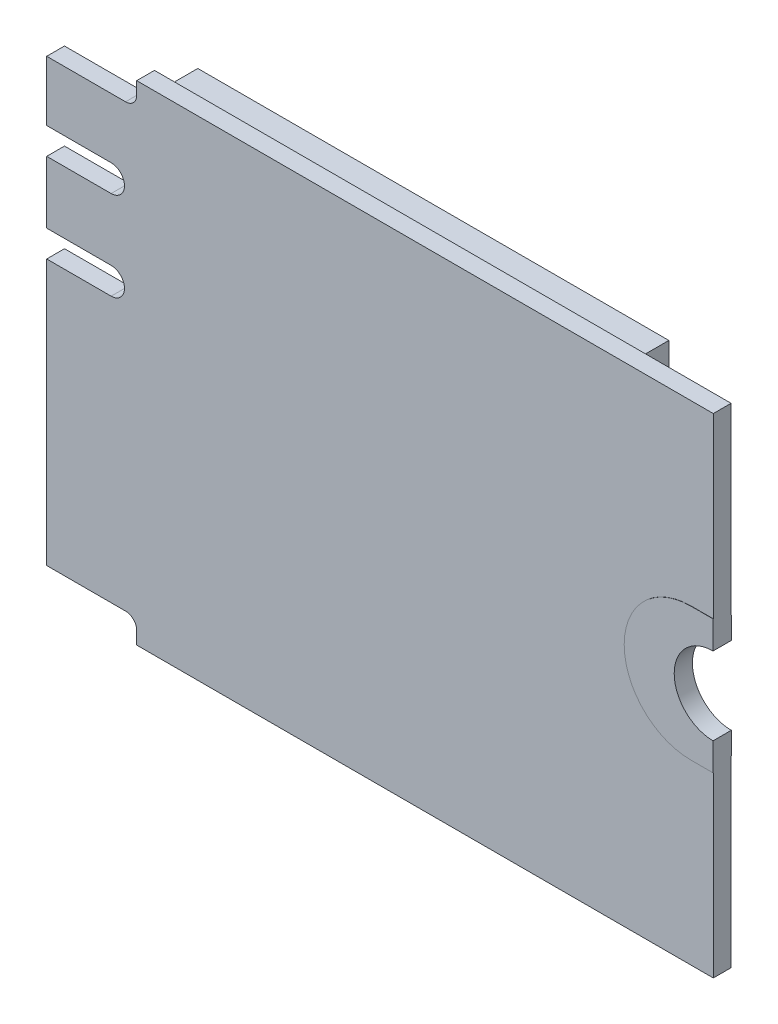
ISO-10303-21;
HEADER;
FILE_DESCRIPTION(('STEP AP214'),'2;1');
FILE_NAME('part.step','',(''),(''),'','','');
FILE_SCHEMA(('AUTOMOTIVE_DESIGN { 1 0 10303 214 1 1 1 1 }'));
ENDSEC;
DATA;
#1=APPLICATION_CONTEXT('core data for automotive mechanical design processes');
#2=APPLICATION_PROTOCOL_DEFINITION('international standard','automotive_design',2000,#1);
#3=PRODUCT_CONTEXT('',#1,'mechanical');
#4=PRODUCT('Part','Part','',(#3));
#5=PRODUCT_RELATED_PRODUCT_CATEGORY('part','',(#4));
#6=PRODUCT_DEFINITION_FORMATION('','',#4);
#7=PRODUCT_DEFINITION_CONTEXT('part definition',#1,'design');
#8=PRODUCT_DEFINITION('design','',#6,#7);
#9=PRODUCT_DEFINITION_SHAPE('','',#8);
#10=(LENGTH_UNIT() NAMED_UNIT(*) SI_UNIT(.MILLI.,.METRE.));
#11=(NAMED_UNIT(*) PLANE_ANGLE_UNIT() SI_UNIT($,.RADIAN.));
#12=(NAMED_UNIT(*) SI_UNIT($,.STERADIAN.) SOLID_ANGLE_UNIT());
#13=UNCERTAINTY_MEASURE_WITH_UNIT(LENGTH_MEASURE(1.E-05),#10,'distance_accuracy_value','');
#14=(GEOMETRIC_REPRESENTATION_CONTEXT(3) GLOBAL_UNCERTAINTY_ASSIGNED_CONTEXT((#13)) GLOBAL_UNIT_ASSIGNED_CONTEXT((#10,
#11,#12)) REPRESENTATION_CONTEXT('',''));
#15=CARTESIAN_POINT('',(0.,0.,0.));
#16=DIRECTION('',(0.,0.,1.));
#17=DIRECTION('',(1.,0.,0.));
#18=AXIS2_PLACEMENT_3D('',#15,#16,#17);
#19=CARTESIAN_POINT('',(72.22,5.45,-8.64));
#20=DIRECTION('',(0.,-1.,0.));
#21=DIRECTION('',(0.,0.,-1.));
#22=AXIS2_PLACEMENT_3D('',#19,#20,#21);
#23=PLANE('',#22);
#24=DIRECTION('',(0.,0.,-1.));
#25=VECTOR('',#24,1.);
#26=CARTESIAN_POINT('',(46.27,5.45,-8.64));
#27=LINE('',#26,#25);
#28=CARTESIAN_POINT('',(46.27,5.45,-8.64));
#29=VERTEX_POINT('',#28);
#30=CARTESIAN_POINT('',(46.27,5.45,-9.44));
#31=VERTEX_POINT('',#30);
#32=EDGE_CURVE('E11',#29,#31,#27,.T.);
#33=ORIENTED_EDGE('',*,*,#32,.T.);
#34=DIRECTION('',(-1.,0.,0.));
#35=VECTOR('',#34,1.);
#36=CARTESIAN_POINT('',(72.22,5.45,-9.44));
#37=LINE('',#36,#35);
#38=CARTESIAN_POINT('',(72.22,5.45,-9.44));
#39=VERTEX_POINT('',#38);
#40=EDGE_CURVE('E204',#39,#31,#37,.T.);
#41=ORIENTED_EDGE('',*,*,#40,.F.);
#42=DIRECTION('',(0.,0.,-1.));
#43=VECTOR('',#42,1.);
#44=CARTESIAN_POINT('',(72.22,5.45,-8.64));
#45=LINE('',#44,#43);
#46=CARTESIAN_POINT('',(72.22,5.45,-8.64));
#47=VERTEX_POINT('',#46);
#48=EDGE_CURVE('E170',#47,#39,#45,.T.);
#49=ORIENTED_EDGE('',*,*,#48,.F.);
#50=DIRECTION('',(-1.,0.,0.));
#51=VECTOR('',#50,1.);
#52=CARTESIAN_POINT('',(72.22,5.45,-8.64));
#53=LINE('',#52,#51);
#54=EDGE_CURVE('E379',#47,#29,#53,.T.);
#55=ORIENTED_EDGE('',*,*,#54,.T.);
#56=EDGE_LOOP('',(#33,#41,#49,#55));
#57=FACE_BOUND('',#56,.T.);
#58=ADVANCED_FACE('F17',(#57),#23,.T.);
#59=CARTESIAN_POINT('',(46.27,5.45,-8.64));
#60=DIRECTION('',(-1.,0.,0.));
#61=DIRECTION('',(0.,0.,1.));
#62=AXIS2_PLACEMENT_3D('',#59,#60,#61);
#63=PLANE('',#62);
#64=DIRECTION('',(0.,1.,0.));
#65=VECTOR('',#64,1.);
#66=CARTESIAN_POINT('',(46.27,5.45,-9.44));
#67=LINE('',#66,#65);
#68=CARTESIAN_POINT('',(46.27,6.025,-9.44));
#69=VERTEX_POINT('',#68);
#70=EDGE_CURVE('E382',#31,#69,#67,.T.);
#71=ORIENTED_EDGE('',*,*,#70,.F.);
#72=ORIENTED_EDGE('',*,*,#32,.F.);
#73=DIRECTION('',(0.,1.,0.));
#74=VECTOR('',#73,1.);
#75=CARTESIAN_POINT('',(46.27,5.45,-8.64));
#76=LINE('',#75,#74);
#77=CARTESIAN_POINT('',(46.27,6.025,-8.64));
#78=VERTEX_POINT('',#77);
#79=EDGE_CURVE('E376',#29,#78,#76,.T.);
#80=ORIENTED_EDGE('',*,*,#79,.T.);
#81=DIRECTION('',(0.,0.,-1.));
#82=VECTOR('',#81,1.);
#83=CARTESIAN_POINT('',(46.27,6.025,-8.64));
#84=LINE('',#83,#82);
#85=EDGE_CURVE('E28',#78,#69,#84,.T.);
#86=ORIENTED_EDGE('',*,*,#85,.T.);
#87=EDGE_LOOP('',(#71,#72,#80,#86));
#88=FACE_BOUND('',#87,.T.);
#89=ADVANCED_FACE('F1080',(#88),#63,.T.);
#90=CARTESIAN_POINT('',(45.77,6.025,-1.522344));
#91=DIRECTION('',(0.,0.,-1.));
#92=DIRECTION('',(0.,1.,0.));
#93=AXIS2_PLACEMENT_3D('',#90,#91,#92);
#94=CYLINDRICAL_SURFACE('',#93,0.5);
#95=CARTESIAN_POINT('',(45.77,6.025,-9.44));
#96=DIRECTION('',(0.,0.,1.));
#97=DIRECTION('',(1.,0.,0.));
#98=AXIS2_PLACEMENT_3D('',#95,#96,#97);
#99=CIRCLE('',#98,0.5);
#100=CARTESIAN_POINT('',(45.77,6.525,-9.44));
#101=VERTEX_POINT('',#100);
#102=EDGE_CURVE('E388',#69,#101,#99,.T.);
#103=ORIENTED_EDGE('',*,*,#102,.F.);
#104=ORIENTED_EDGE('',*,*,#85,.F.);
#105=CARTESIAN_POINT('',(45.77,6.025,-8.64));
#106=DIRECTION('',(0.,0.,-1.));
#107=DIRECTION('',(0.,1.,0.));
#108=AXIS2_PLACEMENT_3D('',#105,#106,#107);
#109=CIRCLE('',#108,0.5);
#110=CARTESIAN_POINT('',(45.77,6.525,-8.64));
#111=VERTEX_POINT('',#110);
#112=EDGE_CURVE('E380',#111,#78,#109,.T.);
#113=ORIENTED_EDGE('',*,*,#112,.F.);
#114=DIRECTION('',(0.,0.,-1.));
#115=VECTOR('',#114,1.);
#116=CARTESIAN_POINT('',(45.77,6.525,-8.64));
#117=LINE('',#116,#115);
#118=EDGE_CURVE('E540',#111,#101,#117,.T.);
#119=ORIENTED_EDGE('',*,*,#118,.T.);
#120=EDGE_LOOP('',(#103,#104,#113,#119));
#121=FACE_BOUND('',#120,.T.);
#122=ADVANCED_FACE('F1043',(#121),#94,.F.);
#123=CARTESIAN_POINT('',(46.27,6.525,-8.64));
#124=DIRECTION('',(0.,-1.,0.));
#125=DIRECTION('',(0.,0.,-1.));
#126=AXIS2_PLACEMENT_3D('',#123,#124,#125);
#127=PLANE('',#126);
#128=DIRECTION('',(-1.,0.,0.));
#129=VECTOR('',#128,1.);
#130=CARTESIAN_POINT('',(45.77,6.525,-8.64));
#131=LINE('',#130,#129);
#132=CARTESIAN_POINT('',(42.22,6.525,-8.64));
#133=VERTEX_POINT('',#132);
#134=EDGE_CURVE('E533',#111,#133,#131,.T.);
#135=ORIENTED_EDGE('',*,*,#134,.T.);
#136=DIRECTION('',(0.,0.,-1.));
#137=VECTOR('',#136,1.);
#138=CARTESIAN_POINT('',(42.22,6.525,-8.64));
#139=LINE('',#138,#137);
#140=CARTESIAN_POINT('',(42.22,6.525,-9.44));
#141=VERTEX_POINT('',#140);
#142=EDGE_CURVE('E537',#133,#141,#139,.T.);
#143=ORIENTED_EDGE('',*,*,#142,.T.);
#144=DIRECTION('',(-1.,0.,0.));
#145=VECTOR('',#144,1.);
#146=CARTESIAN_POINT('',(45.77,6.525,-9.44));
#147=LINE('',#146,#145);
#148=EDGE_CURVE('E397',#101,#141,#147,.T.);
#149=ORIENTED_EDGE('',*,*,#148,.F.);
#150=ORIENTED_EDGE('',*,*,#118,.F.);
#151=EDGE_LOOP('',(#135,#143,#149,#150));
#152=FACE_BOUND('',#151,.T.);
#153=ADVANCED_FACE('F1037',(#152),#127,.T.);
#154=CARTESIAN_POINT('',(42.22,6.525,-8.64));
#155=DIRECTION('',(-1.,0.,0.));
#156=DIRECTION('',(0.,0.,1.));
#157=AXIS2_PLACEMENT_3D('',#154,#155,#156);
#158=PLANE('',#157);
#159=DIRECTION('',(0.,0.,-1.));
#160=VECTOR('',#159,1.);
#161=CARTESIAN_POINT('',(42.22,18.475,-8.64));
#162=LINE('',#161,#160);
#163=CARTESIAN_POINT('',(42.22,18.475,-8.64));
#164=VERTEX_POINT('',#163);
#165=CARTESIAN_POINT('',(42.22,18.475,-9.44));
#166=VERTEX_POINT('',#165);
#167=EDGE_CURVE('E541',#164,#166,#162,.T.);
#168=ORIENTED_EDGE('',*,*,#167,.T.);
#169=DIRECTION('',(0.,1.,0.));
#170=VECTOR('',#169,1.);
#171=CARTESIAN_POINT('',(42.22,6.525,-9.44));
#172=LINE('',#171,#170);
#173=EDGE_CURVE('E478',#141,#166,#172,.T.);
#174=ORIENTED_EDGE('',*,*,#173,.F.);
#175=ORIENTED_EDGE('',*,*,#142,.F.);
#176=DIRECTION('',(0.,1.,0.));
#177=VECTOR('',#176,1.);
#178=CARTESIAN_POINT('',(42.22,6.525,-8.64));
#179=LINE('',#178,#177);
#180=EDGE_CURVE('E21',#133,#164,#179,.T.);
#181=ORIENTED_EDGE('',*,*,#180,.T.);
#182=EDGE_LOOP('',(#168,#174,#175,#181));
#183=FACE_BOUND('',#182,.T.);
#184=ADVANCED_FACE('F1042',(#183),#158,.T.);
#185=CARTESIAN_POINT('',(42.22,18.475,-8.64));
#186=DIRECTION('',(0.,1.,0.));
#187=DIRECTION('',(1.,0.,0.));
#188=AXIS2_PLACEMENT_3D('',#185,#186,#187);
#189=PLANE('',#188);
#190=DIRECTION('',(1.,0.,0.));
#191=VECTOR('',#190,1.);
#192=CARTESIAN_POINT('',(42.22,18.475,-9.44));
#193=LINE('',#192,#191);
#194=CARTESIAN_POINT('',(45.12,18.475,-9.44));
#195=VERTEX_POINT('',#194);
#196=EDGE_CURVE('E482',#166,#195,#193,.T.);
#197=ORIENTED_EDGE('',*,*,#196,.F.);
#198=ORIENTED_EDGE('',*,*,#167,.F.);
#199=DIRECTION('',(1.,0.,0.));
#200=VECTOR('',#199,1.);
#201=CARTESIAN_POINT('',(42.22,18.475,-8.64));
#202=LINE('',#201,#200);
#203=CARTESIAN_POINT('',(45.12,18.475,-8.64));
#204=VERTEX_POINT('',#203);
#205=EDGE_CURVE('E527',#164,#204,#202,.T.);
#206=ORIENTED_EDGE('',*,*,#205,.T.);
#207=DIRECTION('',(0.,0.,-1.));
#208=VECTOR('',#207,1.);
#209=CARTESIAN_POINT('',(45.12,18.475,-8.64));
#210=LINE('',#209,#208);
#211=EDGE_CURVE('E546',#204,#195,#210,.T.);
#212=ORIENTED_EDGE('',*,*,#211,.T.);
#213=EDGE_LOOP('',(#197,#198,#206,#212));
#214=FACE_BOUND('',#213,.T.);
#215=ADVANCED_FACE('F19',(#214),#189,.T.);
#216=CARTESIAN_POINT('',(45.12,19.075,-1.522344));
#217=DIRECTION('',(0.,0.,-1.));
#218=DIRECTION('',(0.,1.,0.));
#219=AXIS2_PLACEMENT_3D('',#216,#217,#218);
#220=CYLINDRICAL_SURFACE('',#219,0.6);
#221=CARTESIAN_POINT('',(45.12,19.075,-9.44));
#222=DIRECTION('',(0.,0.,-1.));
#223=DIRECTION('',(0.,1.,0.));
#224=AXIS2_PLACEMENT_3D('',#221,#222,#223);
#225=CIRCLE('',#224,0.6);
#226=CARTESIAN_POINT('',(45.12,19.675,-9.44));
#227=VERTEX_POINT('',#226);
#228=EDGE_CURVE('E504',#227,#195,#225,.T.);
#229=ORIENTED_EDGE('',*,*,#228,.T.);
#230=ORIENTED_EDGE('',*,*,#211,.F.);
#231=CARTESIAN_POINT('',(45.12,19.075,-8.64));
#232=DIRECTION('',(0.,0.,1.));
#233=DIRECTION('',(0.,-1.,0.));
#234=AXIS2_PLACEMENT_3D('',#231,#232,#233);
#235=CIRCLE('',#234,0.6);
#236=CARTESIAN_POINT('',(45.12,19.675,-8.64));
#237=VERTEX_POINT('',#236);
#238=EDGE_CURVE('E523',#204,#237,#235,.T.);
#239=ORIENTED_EDGE('',*,*,#238,.T.);
#240=DIRECTION('',(0.,0.,-1.));
#241=VECTOR('',#240,1.);
#242=CARTESIAN_POINT('',(45.12,19.675,-8.64));
#243=LINE('',#242,#241);
#244=EDGE_CURVE('E340',#237,#227,#243,.T.);
#245=ORIENTED_EDGE('',*,*,#244,.T.);
#246=EDGE_LOOP('',(#229,#230,#239,#245));
#247=FACE_BOUND('',#246,.T.);
#248=ADVANCED_FACE('F1110',(#247),#220,.F.);
#249=CARTESIAN_POINT('',(45.72,19.675,-8.64));
#250=DIRECTION('',(0.,-1.,0.));
#251=DIRECTION('',(0.,0.,-1.));
#252=AXIS2_PLACEMENT_3D('',#249,#250,#251);
#253=PLANE('',#252);
#254=DIRECTION('',(-1.,0.,0.));
#255=VECTOR('',#254,1.);
#256=CARTESIAN_POINT('',(45.12,19.675,-8.64));
#257=LINE('',#256,#255);
#258=CARTESIAN_POINT('',(42.22,19.675,-8.64));
#259=VERTEX_POINT('',#258);
#260=EDGE_CURVE('E474',#237,#259,#257,.T.);
#261=ORIENTED_EDGE('',*,*,#260,.T.);
#262=DIRECTION('',(0.,0.,-1.));
#263=VECTOR('',#262,1.);
#264=CARTESIAN_POINT('',(42.22,19.675,-8.64));
#265=LINE('',#264,#263);
#266=CARTESIAN_POINT('',(42.22,19.675,-9.44));
#267=VERTEX_POINT('',#266);
#268=EDGE_CURVE('E337',#259,#267,#265,.T.);
#269=ORIENTED_EDGE('',*,*,#268,.T.);
#270=DIRECTION('',(-1.,0.,0.));
#271=VECTOR('',#270,1.);
#272=CARTESIAN_POINT('',(45.12,19.675,-9.44));
#273=LINE('',#272,#271);
#274=EDGE_CURVE('E470',#227,#267,#273,.T.);
#275=ORIENTED_EDGE('',*,*,#274,.F.);
#276=ORIENTED_EDGE('',*,*,#244,.F.);
#277=EDGE_LOOP('',(#261,#269,#275,#276));
#278=FACE_BOUND('',#277,.T.);
#279=ADVANCED_FACE('F1115',(#278),#253,.T.);
#280=CARTESIAN_POINT('',(42.22,19.675,-8.64));
#281=DIRECTION('',(-1.,0.,0.));
#282=DIRECTION('',(0.,0.,1.));
#283=AXIS2_PLACEMENT_3D('',#280,#281,#282);
#284=PLANE('',#283);
#285=DIRECTION('',(0.,0.,-1.));
#286=VECTOR('',#285,1.);
#287=CARTESIAN_POINT('',(42.22,22.475,-8.64));
#288=LINE('',#287,#286);
#289=CARTESIAN_POINT('',(42.22,22.475,-8.64));
#290=VERTEX_POINT('',#289);
#291=CARTESIAN_POINT('',(42.22,22.475,-9.44));
#292=VERTEX_POINT('',#291);
#293=EDGE_CURVE('E341',#290,#292,#288,.T.);
#294=ORIENTED_EDGE('',*,*,#293,.T.);
#295=DIRECTION('',(0.,1.,0.));
#296=VECTOR('',#295,1.);
#297=CARTESIAN_POINT('',(42.22,19.675,-9.44));
#298=LINE('',#297,#296);
#299=EDGE_CURVE('E465',#267,#292,#298,.T.);
#300=ORIENTED_EDGE('',*,*,#299,.F.);
#301=ORIENTED_EDGE('',*,*,#268,.F.);
#302=DIRECTION('',(0.,1.,0.));
#303=VECTOR('',#302,1.);
#304=CARTESIAN_POINT('',(42.22,19.675,-8.64));
#305=LINE('',#304,#303);
#306=EDGE_CURVE('E464',#259,#290,#305,.T.);
#307=ORIENTED_EDGE('',*,*,#306,.T.);
#308=EDGE_LOOP('',(#294,#300,#301,#307));
#309=FACE_BOUND('',#308,.T.);
#310=ADVANCED_FACE('F1168',(#309),#284,.T.);
#311=CARTESIAN_POINT('',(42.22,22.475,-8.64));
#312=DIRECTION('',(0.,1.,0.));
#313=DIRECTION('',(1.,0.,0.));
#314=AXIS2_PLACEMENT_3D('',#311,#312,#313);
#315=PLANE('',#314);
#316=DIRECTION('',(1.,0.,0.));
#317=VECTOR('',#316,1.);
#318=CARTESIAN_POINT('',(42.22,22.475,-9.44));
#319=LINE('',#318,#317);
#320=CARTESIAN_POINT('',(45.12,22.475,-9.44));
#321=VERTEX_POINT('',#320);
#322=EDGE_CURVE('E469',#292,#321,#319,.T.);
#323=ORIENTED_EDGE('',*,*,#322,.F.);
#324=ORIENTED_EDGE('',*,*,#293,.F.);
#325=DIRECTION('',(1.,0.,0.));
#326=VECTOR('',#325,1.);
#327=CARTESIAN_POINT('',(42.22,22.475,-8.64));
#328=LINE('',#327,#326);
#329=CARTESIAN_POINT('',(45.12,22.475,-8.64));
#330=VERTEX_POINT('',#329);
#331=EDGE_CURVE('E460',#290,#330,#328,.T.);
#332=ORIENTED_EDGE('',*,*,#331,.T.);
#333=DIRECTION('',(0.,0.,-1.));
#334=VECTOR('',#333,1.);
#335=CARTESIAN_POINT('',(45.12,22.475,-8.64));
#336=LINE('',#335,#334);
#337=EDGE_CURVE('E492',#330,#321,#336,.T.);
#338=ORIENTED_EDGE('',*,*,#337,.T.);
#339=EDGE_LOOP('',(#323,#324,#332,#338));
#340=FACE_BOUND('',#339,.T.);
#341=ADVANCED_FACE('F1103',(#340),#315,.T.);
#342=CARTESIAN_POINT('',(45.12,23.075,-1.522344));
#343=DIRECTION('',(0.,0.,-1.));
#344=DIRECTION('',(0.,1.,0.));
#345=AXIS2_PLACEMENT_3D('',#342,#343,#344);
#346=CYLINDRICAL_SURFACE('',#345,0.6);
#347=CARTESIAN_POINT('',(45.12,23.075,-9.44));
#348=DIRECTION('',(0.,0.,-1.));
#349=DIRECTION('',(0.,1.,0.));
#350=AXIS2_PLACEMENT_3D('',#347,#348,#349);
#351=CIRCLE('',#350,0.6);
#352=CARTESIAN_POINT('',(45.12,23.675,-9.44));
#353=VERTEX_POINT('',#352);
#354=EDGE_CURVE('E522',#353,#321,#351,.T.);
#355=ORIENTED_EDGE('',*,*,#354,.T.);
#356=ORIENTED_EDGE('',*,*,#337,.F.);
#357=CARTESIAN_POINT('',(45.12,23.075,-8.64));
#358=DIRECTION('',(0.,0.,1.));
#359=DIRECTION('',(0.,-1.,0.));
#360=AXIS2_PLACEMENT_3D('',#357,#358,#359);
#361=CIRCLE('',#360,0.6);
#362=CARTESIAN_POINT('',(45.12,23.675,-8.64));
#363=VERTEX_POINT('',#362);
#364=EDGE_CURVE('E459',#330,#363,#361,.T.);
#365=ORIENTED_EDGE('',*,*,#364,.T.);
#366=DIRECTION('',(0.,0.,-1.));
#367=VECTOR('',#366,1.);
#368=CARTESIAN_POINT('',(45.12,23.675,-8.64));
#369=LINE('',#368,#367);
#370=EDGE_CURVE('E349',#363,#353,#369,.T.);
#371=ORIENTED_EDGE('',*,*,#370,.T.);
#372=EDGE_LOOP('',(#355,#356,#365,#371));
#373=FACE_BOUND('',#372,.T.);
#374=ADVANCED_FACE('F1097',(#373),#346,.F.);
#375=CARTESIAN_POINT('',(45.72,23.675,-8.64));
#376=DIRECTION('',(0.,-1.,0.));
#377=DIRECTION('',(0.,0.,-1.));
#378=AXIS2_PLACEMENT_3D('',#375,#376,#377);
#379=PLANE('',#378);
#380=DIRECTION('',(-1.,0.,0.));
#381=VECTOR('',#380,1.);
#382=CARTESIAN_POINT('',(45.12,23.675,-8.64));
#383=LINE('',#382,#381);
#384=CARTESIAN_POINT('',(42.22,23.675,-8.64));
#385=VERTEX_POINT('',#384);
#386=EDGE_CURVE('E300',#363,#385,#383,.T.);
#387=ORIENTED_EDGE('',*,*,#386,.T.);
#388=DIRECTION('',(0.,0.,-1.));
#389=VECTOR('',#388,1.);
#390=CARTESIAN_POINT('',(42.22,23.675,-8.64));
#391=LINE('',#390,#389);
#392=CARTESIAN_POINT('',(42.22,23.675,-9.44));
#393=VERTEX_POINT('',#392);
#394=EDGE_CURVE('E273',#385,#393,#391,.T.);
#395=ORIENTED_EDGE('',*,*,#394,.T.);
#396=DIRECTION('',(-1.,0.,0.));
#397=VECTOR('',#396,1.);
#398=CARTESIAN_POINT('',(45.12,23.675,-9.44));
#399=LINE('',#398,#397);
#400=EDGE_CURVE('E401',#353,#393,#399,.T.);
#401=ORIENTED_EDGE('',*,*,#400,.F.);
#402=ORIENTED_EDGE('',*,*,#370,.F.);
#403=EDGE_LOOP('',(#387,#395,#401,#402));
#404=FACE_BOUND('',#403,.T.);
#405=ADVANCED_FACE('F1102',(#404),#379,.T.);
#406=CARTESIAN_POINT('',(42.22,23.675,-8.64));
#407=DIRECTION('',(-1.,0.,0.));
#408=DIRECTION('',(0.,0.,1.));
#409=AXIS2_PLACEMENT_3D('',#406,#407,#408);
#410=PLANE('',#409);
#411=DIRECTION('',(0.,0.,-1.));
#412=VECTOR('',#411,1.);
#413=CARTESIAN_POINT('',(42.22,26.375,-8.64));
#414=LINE('',#413,#412);
#415=CARTESIAN_POINT('',(42.22,26.375,-8.64));
#416=VERTEX_POINT('',#415);
#417=CARTESIAN_POINT('',(42.22,26.375,-9.44));
#418=VERTEX_POINT('',#417);
#419=EDGE_CURVE('E262',#416,#418,#414,.T.);
#420=ORIENTED_EDGE('',*,*,#419,.T.);
#421=DIRECTION('',(0.,1.,0.));
#422=VECTOR('',#421,1.);
#423=CARTESIAN_POINT('',(42.22,23.675,-9.44));
#424=LINE('',#423,#422);
#425=EDGE_CURVE('E456',#393,#418,#424,.T.);
#426=ORIENTED_EDGE('',*,*,#425,.F.);
#427=ORIENTED_EDGE('',*,*,#394,.F.);
#428=DIRECTION('',(0.,1.,0.));
#429=VECTOR('',#428,1.);
#430=CARTESIAN_POINT('',(42.22,23.675,-8.64));
#431=LINE('',#430,#429);
#432=EDGE_CURVE('E295',#385,#416,#431,.T.);
#433=ORIENTED_EDGE('',*,*,#432,.T.);
#434=EDGE_LOOP('',(#420,#426,#427,#433));
#435=FACE_BOUND('',#434,.T.);
#436=ADVANCED_FACE('F296',(#435),#410,.T.);
#437=CARTESIAN_POINT('',(42.22,26.375,-8.64));
#438=DIRECTION('',(0.,1.,0.));
#439=DIRECTION('',(1.,0.,0.));
#440=AXIS2_PLACEMENT_3D('',#437,#438,#439);
#441=PLANE('',#440);
#442=DIRECTION('',(1.,0.,0.));
#443=VECTOR('',#442,1.);
#444=CARTESIAN_POINT('',(42.22,26.375,-9.44));
#445=LINE('',#444,#443);
#446=CARTESIAN_POINT('',(45.77,26.375,-9.44));
#447=VERTEX_POINT('',#446);
#448=EDGE_CURVE('E289',#418,#447,#445,.T.);
#449=ORIENTED_EDGE('',*,*,#448,.F.);
#450=ORIENTED_EDGE('',*,*,#419,.F.);
#451=DIRECTION('',(1.,0.,0.));
#452=VECTOR('',#451,1.);
#453=CARTESIAN_POINT('',(42.22,26.375,-8.64));
#454=LINE('',#453,#452);
#455=CARTESIAN_POINT('',(45.77,26.375,-8.64));
#456=VERTEX_POINT('',#455);
#457=EDGE_CURVE('E286',#416,#456,#454,.T.);
#458=ORIENTED_EDGE('',*,*,#457,.T.);
#459=DIRECTION('',(0.,0.,-1.));
#460=VECTOR('',#459,1.);
#461=CARTESIAN_POINT('',(45.77,26.375,-8.64));
#462=LINE('',#461,#460);
#463=EDGE_CURVE('E292',#456,#447,#462,.T.);
#464=ORIENTED_EDGE('',*,*,#463,.T.);
#465=EDGE_LOOP('',(#449,#450,#458,#464));
#466=FACE_BOUND('',#465,.T.);
#467=ADVANCED_FACE('F284',(#466),#441,.T.);
#468=CARTESIAN_POINT('',(45.77,26.875,-1.522344));
#469=DIRECTION('',(0.,0.,-1.));
#470=DIRECTION('',(1.,0.,0.));
#471=AXIS2_PLACEMENT_3D('',#468,#469,#470);
#472=CYLINDRICAL_SURFACE('',#471,0.5);
#473=CARTESIAN_POINT('',(45.77,26.875,-9.44));
#474=DIRECTION('',(0.,0.,1.));
#475=DIRECTION('',(0.,-1.,0.));
#476=AXIS2_PLACEMENT_3D('',#473,#474,#475);
#477=CIRCLE('',#476,0.5);
#478=CARTESIAN_POINT('',(46.27,26.875,-9.44));
#479=VERTEX_POINT('',#478);
#480=EDGE_CURVE('E346',#447,#479,#477,.T.);
#481=ORIENTED_EDGE('',*,*,#480,.F.);
#482=ORIENTED_EDGE('',*,*,#463,.F.);
#483=CARTESIAN_POINT('',(45.77,26.875,-8.64));
#484=DIRECTION('',(0.,0.,-1.));
#485=DIRECTION('',(1.,0.,0.));
#486=AXIS2_PLACEMENT_3D('',#483,#484,#485);
#487=CIRCLE('',#486,0.5);
#488=CARTESIAN_POINT('',(46.27,26.875,-8.64));
#489=VERTEX_POINT('',#488);
#490=EDGE_CURVE('E306',#489,#456,#487,.T.);
#491=ORIENTED_EDGE('',*,*,#490,.F.);
#492=DIRECTION('',(0.,0.,-1.));
#493=VECTOR('',#492,1.);
#494=CARTESIAN_POINT('',(46.27,26.875,-8.64));
#495=LINE('',#494,#493);
#496=EDGE_CURVE('E356',#489,#479,#495,.T.);
#497=ORIENTED_EDGE('',*,*,#496,.T.);
#498=EDGE_LOOP('',(#481,#482,#491,#497));
#499=FACE_BOUND('',#498,.T.);
#500=ADVANCED_FACE('F1122',(#499),#472,.F.);
#501=CARTESIAN_POINT('',(46.27,26.375,-8.64));
#502=DIRECTION('',(-1.,0.,0.));
#503=DIRECTION('',(0.,0.,1.));
#504=AXIS2_PLACEMENT_3D('',#501,#502,#503);
#505=PLANE('',#504);
#506=DIRECTION('',(0.,1.,0.));
#507=VECTOR('',#506,1.);
#508=CARTESIAN_POINT('',(46.27,26.875,-8.64));
#509=LINE('',#508,#507);
#510=CARTESIAN_POINT('',(46.27,27.45,-8.64));
#511=VERTEX_POINT('',#510);
#512=EDGE_CURVE('E315',#489,#511,#509,.T.);
#513=ORIENTED_EDGE('',*,*,#512,.T.);
#514=DIRECTION('',(0.,0.,-1.));
#515=VECTOR('',#514,1.);
#516=CARTESIAN_POINT('',(46.27,27.45,-8.64));
#517=LINE('',#516,#515);
#518=CARTESIAN_POINT('',(46.27,27.45,-9.44));
#519=VERTEX_POINT('',#518);
#520=EDGE_CURVE('E566',#511,#519,#517,.T.);
#521=ORIENTED_EDGE('',*,*,#520,.T.);
#522=DIRECTION('',(0.,1.,0.));
#523=VECTOR('',#522,1.);
#524=CARTESIAN_POINT('',(46.27,26.875,-9.44));
#525=LINE('',#524,#523);
#526=EDGE_CURVE('E342',#479,#519,#525,.T.);
#527=ORIENTED_EDGE('',*,*,#526,.F.);
#528=ORIENTED_EDGE('',*,*,#496,.F.);
#529=EDGE_LOOP('',(#513,#521,#527,#528));
#530=FACE_BOUND('',#529,.T.);
#531=ADVANCED_FACE('F1090',(#530),#505,.T.);
#532=CARTESIAN_POINT('',(46.27,27.45,-8.64));
#533=DIRECTION('',(0.,1.,0.));
#534=DIRECTION('',(1.,0.,0.));
#535=AXIS2_PLACEMENT_3D('',#532,#533,#534);
#536=PLANE('',#535);
#537=DIRECTION('',(0.,0.,-1.));
#538=VECTOR('',#537,1.);
#539=CARTESIAN_POINT('',(72.22,27.45,-8.64));
#540=LINE('',#539,#538);
#541=CARTESIAN_POINT('',(72.22,27.45,-8.64));
#542=VERTEX_POINT('',#541);
#543=CARTESIAN_POINT('',(72.22,27.45,-9.44));
#544=VERTEX_POINT('',#543);
#545=EDGE_CURVE('E496',#542,#544,#540,.T.);
#546=ORIENTED_EDGE('',*,*,#545,.T.);
#547=DIRECTION('',(1.,0.,0.));
#548=VECTOR('',#547,1.);
#549=CARTESIAN_POINT('',(46.27,27.45,-9.44));
#550=LINE('',#549,#548);
#551=EDGE_CURVE('E319',#519,#544,#550,.T.);
#552=ORIENTED_EDGE('',*,*,#551,.F.);
#553=ORIENTED_EDGE('',*,*,#520,.F.);
#554=DIRECTION('',(1.,0.,0.));
#555=VECTOR('',#554,1.);
#556=CARTESIAN_POINT('',(46.27,27.45,-8.64));
#557=LINE('',#556,#555);
#558=EDGE_CURVE('E367',#511,#542,#557,.T.);
#559=ORIENTED_EDGE('',*,*,#558,.T.);
#560=EDGE_LOOP('',(#546,#552,#553,#559));
#561=FACE_BOUND('',#560,.T.);
#562=ADVANCED_FACE('F1085',(#561),#536,.T.);
#563=CARTESIAN_POINT('',(0.,0.,-10.89));
#564=DIRECTION('',(0.,0.,-1.));
#565=DIRECTION('',(0.,-1.,0.));
#566=AXIS2_PLACEMENT_3D('',#563,#564,#565);
#567=PLANE('',#566);
#568=DIRECTION('',(-1.,0.,0.));
#569=VECTOR('',#568,1.);
#570=CARTESIAN_POINT('',(67.97,5.85,-10.89));
#571=LINE('',#570,#569);
#572=CARTESIAN_POINT('',(67.97,5.85,-10.89));
#573=VERTEX_POINT('',#572);
#574=CARTESIAN_POINT('',(46.77,5.85,-10.89));
#575=VERTEX_POINT('',#574);
#576=EDGE_CURVE('E42',#573,#575,#571,.T.);
#577=ORIENTED_EDGE('',*,*,#576,.T.);
#578=DIRECTION('',(0.,1.,0.));
#579=VECTOR('',#578,1.);
#580=CARTESIAN_POINT('',(46.77,5.85,-10.89));
#581=LINE('',#580,#579);
#582=CARTESIAN_POINT('',(46.77,27.05,-10.89));
#583=VERTEX_POINT('',#582);
#584=EDGE_CURVE('E335',#575,#583,#581,.T.);
#585=ORIENTED_EDGE('',*,*,#584,.T.);
#586=DIRECTION('',(1.,0.,0.));
#587=VECTOR('',#586,1.);
#588=CARTESIAN_POINT('',(46.77,27.05,-10.89));
#589=LINE('',#588,#587);
#590=CARTESIAN_POINT('',(67.97,27.05,-10.89));
#591=VERTEX_POINT('',#590);
#592=EDGE_CURVE('E330',#583,#591,#589,.T.);
#593=ORIENTED_EDGE('',*,*,#592,.T.);
#594=DIRECTION('',(0.,-1.,0.));
#595=VECTOR('',#594,1.);
#596=CARTESIAN_POINT('',(67.97,27.05,-10.89));
#597=LINE('',#596,#595);
#598=EDGE_CURVE('E331',#591,#573,#597,.T.);
#599=ORIENTED_EDGE('',*,*,#598,.T.);
#600=EDGE_LOOP('',(#577,#585,#593,#599));
#601=FACE_BOUND('',#600,.T.);
#602=ADVANCED_FACE('F1068',(#601),#567,.T.);
#603=CARTESIAN_POINT('',(67.97,5.85,-9.44));
#604=DIRECTION('',(0.,-1.,0.));
#605=DIRECTION('',(0.,0.,-1.));
#606=AXIS2_PLACEMENT_3D('',#603,#604,#605);
#607=PLANE('',#606);
#608=DIRECTION('',(0.,0.,-1.));
#609=VECTOR('',#608,1.);
#610=CARTESIAN_POINT('',(46.77,5.85,-9.44));
#611=LINE('',#610,#609);
#612=CARTESIAN_POINT('',(46.77,5.85,-9.44));
#613=VERTEX_POINT('',#612);
#614=EDGE_CURVE('E528',#613,#575,#611,.T.);
#615=ORIENTED_EDGE('',*,*,#614,.T.);
#616=ORIENTED_EDGE('',*,*,#576,.F.);
#617=DIRECTION('',(0.,0.,-1.));
#618=VECTOR('',#617,1.);
#619=CARTESIAN_POINT('',(67.97,5.85,-9.44));
#620=LINE('',#619,#618);
#621=CARTESIAN_POINT('',(67.97,5.85,-9.44));
#622=VERTEX_POINT('',#621);
#623=EDGE_CURVE('E489',#622,#573,#620,.T.);
#624=ORIENTED_EDGE('',*,*,#623,.F.);
#625=DIRECTION('',(-1.,0.,0.));
#626=VECTOR('',#625,1.);
#627=CARTESIAN_POINT('',(67.97,5.85,-9.44));
#628=LINE('',#627,#626);
#629=EDGE_CURVE('E374',#622,#613,#628,.T.);
#630=ORIENTED_EDGE('',*,*,#629,.T.);
#631=EDGE_LOOP('',(#615,#616,#624,#630));
#632=FACE_BOUND('',#631,.T.);
#633=ADVANCED_FACE('F1062',(#632),#607,.T.);
#634=CARTESIAN_POINT('',(46.77,5.85,-9.44));
#635=DIRECTION('',(-1.,0.,0.));
#636=DIRECTION('',(0.,0.,1.));
#637=AXIS2_PLACEMENT_3D('',#634,#635,#636);
#638=PLANE('',#637);
#639=DIRECTION('',(0.,0.,-1.));
#640=VECTOR('',#639,1.);
#641=CARTESIAN_POINT('',(46.77,27.05,-9.44));
#642=LINE('',#641,#640);
#643=CARTESIAN_POINT('',(46.77,27.05,-9.44));
#644=VERTEX_POINT('',#643);
#645=EDGE_CURVE('E332',#644,#583,#642,.T.);
#646=ORIENTED_EDGE('',*,*,#645,.T.);
#647=ORIENTED_EDGE('',*,*,#584,.F.);
#648=ORIENTED_EDGE('',*,*,#614,.F.);
#649=DIRECTION('',(0.,1.,0.));
#650=VECTOR('',#649,1.);
#651=CARTESIAN_POINT('',(46.77,5.85,-9.44));
#652=LINE('',#651,#650);
#653=EDGE_CURVE('E370',#613,#644,#652,.T.);
#654=ORIENTED_EDGE('',*,*,#653,.T.);
#655=EDGE_LOOP('',(#646,#647,#648,#654));
#656=FACE_BOUND('',#655,.T.);
#657=ADVANCED_FACE('F1067',(#656),#638,.T.);
#658=CARTESIAN_POINT('',(46.77,27.05,-9.44));
#659=DIRECTION('',(0.,1.,0.));
#660=DIRECTION('',(1.,0.,0.));
#661=AXIS2_PLACEMENT_3D('',#658,#659,#660);
#662=PLANE('',#661);
#663=DIRECTION('',(0.,0.,-1.));
#664=VECTOR('',#663,1.);
#665=CARTESIAN_POINT('',(67.97,27.05,-9.44));
#666=LINE('',#665,#664);
#667=CARTESIAN_POINT('',(67.97,27.05,-9.44));
#668=VERTEX_POINT('',#667);
#669=EDGE_CURVE('E326',#668,#591,#666,.T.);
#670=ORIENTED_EDGE('',*,*,#669,.T.);
#671=ORIENTED_EDGE('',*,*,#592,.F.);
#672=ORIENTED_EDGE('',*,*,#645,.F.);
#673=DIRECTION('',(1.,0.,0.));
#674=VECTOR('',#673,1.);
#675=CARTESIAN_POINT('',(46.77,27.05,-9.44));
#676=LINE('',#675,#674);
#677=EDGE_CURVE('E375',#644,#668,#676,.T.);
#678=ORIENTED_EDGE('',*,*,#677,.T.);
#679=EDGE_LOOP('',(#670,#671,#672,#678));
#680=FACE_BOUND('',#679,.T.);
#681=ADVANCED_FACE('F1225',(#680),#662,.T.);
#682=CARTESIAN_POINT('',(67.97,27.05,-9.44));
#683=DIRECTION('',(1.,0.,0.));
#684=DIRECTION('',(0.,1.,0.));
#685=AXIS2_PLACEMENT_3D('',#682,#683,#684);
#686=PLANE('',#685);
#687=ORIENTED_EDGE('',*,*,#623,.T.);
#688=ORIENTED_EDGE('',*,*,#598,.F.);
#689=ORIENTED_EDGE('',*,*,#669,.F.);
#690=DIRECTION('',(0.,-1.,0.));
#691=VECTOR('',#690,1.);
#692=CARTESIAN_POINT('',(67.97,27.05,-9.44));
#693=LINE('',#692,#691);
#694=EDGE_CURVE('E485',#668,#622,#693,.T.);
#695=ORIENTED_EDGE('',*,*,#694,.T.);
#696=EDGE_LOOP('',(#687,#688,#689,#695));
#697=FACE_BOUND('',#696,.T.);
#698=ADVANCED_FACE('F1230',(#697),#686,.T.);
#699=CARTESIAN_POINT('',(0.,0.,-9.44));
#700=DIRECTION('',(0.,0.,-1.));
#701=DIRECTION('',(0.,-1.,0.));
#702=AXIS2_PLACEMENT_3D('',#699,#700,#701);
#703=PLANE('',#702);
#704=ORIENTED_EDGE('',*,*,#677,.F.);
#705=ORIENTED_EDGE('',*,*,#653,.F.);
#706=ORIENTED_EDGE('',*,*,#629,.F.);
#707=ORIENTED_EDGE('',*,*,#694,.F.);
#708=EDGE_LOOP('',(#704,#705,#706,#707));
#709=FACE_BOUND('',#708,.T.);
#710=DIRECTION('',(0.,-1.,0.));
#711=VECTOR('',#710,1.);
#712=CARTESIAN_POINT('',(72.22,13.7,-9.44));
#713=LINE('',#712,#711);
#714=CARTESIAN_POINT('',(72.22,13.7,-9.44));
#715=VERTEX_POINT('',#714);
#716=EDGE_CURVE('E359',#715,#39,#713,.T.);
#717=ORIENTED_EDGE('',*,*,#716,.T.);
#718=ORIENTED_EDGE('',*,*,#40,.T.);
#719=ORIENTED_EDGE('',*,*,#70,.T.);
#720=ORIENTED_EDGE('',*,*,#102,.T.);
#721=ORIENTED_EDGE('',*,*,#148,.T.);
#722=ORIENTED_EDGE('',*,*,#173,.T.);
#723=ORIENTED_EDGE('',*,*,#196,.T.);
#724=ORIENTED_EDGE('',*,*,#228,.F.);
#725=ORIENTED_EDGE('',*,*,#274,.T.);
#726=ORIENTED_EDGE('',*,*,#299,.T.);
#727=ORIENTED_EDGE('',*,*,#322,.T.);
#728=ORIENTED_EDGE('',*,*,#354,.F.);
#729=ORIENTED_EDGE('',*,*,#400,.T.);
#730=ORIENTED_EDGE('',*,*,#425,.T.);
#731=ORIENTED_EDGE('',*,*,#448,.T.);
#732=ORIENTED_EDGE('',*,*,#480,.T.);
#733=ORIENTED_EDGE('',*,*,#526,.T.);
#734=ORIENTED_EDGE('',*,*,#551,.T.);
#735=DIRECTION('',(0.,-1.,0.));
#736=VECTOR('',#735,1.);
#737=CARTESIAN_POINT('',(72.22,27.45,-9.44));
#738=LINE('',#737,#736);
#739=CARTESIAN_POINT('',(72.22,19.2,-9.44));
#740=VERTEX_POINT('',#739);
#741=EDGE_CURVE('E493',#544,#740,#738,.T.);
#742=ORIENTED_EDGE('',*,*,#741,.T.);
#743=CARTESIAN_POINT('',(72.22,16.45,-9.44));
#744=DIRECTION('',(0.,0.,-1.));
#745=DIRECTION('',(0.,-1.,0.));
#746=AXIS2_PLACEMENT_3D('',#743,#744,#745);
#747=CIRCLE('',#746,2.75);
#748=EDGE_CURVE('E195',#715,#740,#747,.T.);
#749=ORIENTED_EDGE('',*,*,#748,.F.);
#750=EDGE_LOOP('',(#717,#718,#719,#720,#721,#722,#723,#724,#725,#726,#727,#728,#729,#730,#731,
#732,#733,#734,#742,#749));
#751=FACE_BOUND('',#750,.T.);
#752=ADVANCED_FACE('F1145',(#709,#751),#703,.T.);
#753=CARTESIAN_POINT('',(72.22,16.45,-9.44));
#754=DIRECTION('',(0.,0.,-1.));
#755=DIRECTION('',(0.,-1.,0.));
#756=AXIS2_PLACEMENT_3D('',#753,#754,#755);
#757=CYLINDRICAL_SURFACE('',#756,2.75);
#758=DIRECTION('',(0.,0.,-1.));
#759=VECTOR('',#758,1.);
#760=CARTESIAN_POINT('',(72.22,19.2,-9.44));
#761=LINE('',#760,#759);
#762=CARTESIAN_POINT('',(72.22,19.2,-9.45));
#763=VERTEX_POINT('',#762);
#764=EDGE_CURVE('E497',#740,#763,#761,.T.);
#765=ORIENTED_EDGE('',*,*,#764,.T.);
#766=CARTESIAN_POINT('',(72.22,16.45,-9.45));
#767=DIRECTION('',(0.,0.,-1.));
#768=DIRECTION('',(0.,-1.,0.));
#769=AXIS2_PLACEMENT_3D('',#766,#767,#768);
#770=CIRCLE('',#769,2.75);
#771=CARTESIAN_POINT('',(72.22,13.7,-9.45));
#772=VERTEX_POINT('',#771);
#773=EDGE_CURVE('E363',#772,#763,#770,.T.);
#774=ORIENTED_EDGE('',*,*,#773,.F.);
#775=DIRECTION('',(0.,0.,-1.));
#776=VECTOR('',#775,1.);
#777=CARTESIAN_POINT('',(72.22,13.7,-9.44));
#778=LINE('',#777,#776);
#779=EDGE_CURVE('E406',#715,#772,#778,.T.);
#780=ORIENTED_EDGE('',*,*,#779,.F.);
#781=ORIENTED_EDGE('',*,*,#748,.T.);
#782=EDGE_LOOP('',(#765,#774,#780,#781));
#783=FACE_BOUND('',#782,.T.);
#784=ADVANCED_FACE('F1139',(#783),#757,.T.);
#785=CARTESIAN_POINT('',(0.,0.,-9.45));
#786=DIRECTION('',(0.,0.,-1.));
#787=DIRECTION('',(0.,-1.,0.));
#788=AXIS2_PLACEMENT_3D('',#785,#786,#787);
#789=PLANE('',#788);
#790=DIRECTION('',(0.,-1.,0.));
#791=VECTOR('',#790,1.);
#792=CARTESIAN_POINT('',(72.22,19.2,-9.45));
#793=LINE('',#792,#791);
#794=CARTESIAN_POINT('',(72.22,18.2,-9.45));
#795=VERTEX_POINT('',#794);
#796=EDGE_CURVE('E507',#763,#795,#793,.T.);
#797=ORIENTED_EDGE('',*,*,#796,.T.);
#798=CARTESIAN_POINT('',(72.22,16.45,-9.45));
#799=DIRECTION('',(0.,0.,1.));
#800=DIRECTION('',(0.,1.,0.));
#801=AXIS2_PLACEMENT_3D('',#798,#799,#800);
#802=CIRCLE('',#801,1.75);
#803=CARTESIAN_POINT('',(72.22,14.7,-9.45));
#804=VERTEX_POINT('',#803);
#805=EDGE_CURVE('E321',#795,#804,#802,.T.);
#806=ORIENTED_EDGE('',*,*,#805,.T.);
#807=DIRECTION('',(0.,-1.,0.));
#808=VECTOR('',#807,1.);
#809=CARTESIAN_POINT('',(72.22,14.7,-9.45));
#810=LINE('',#809,#808);
#811=EDGE_CURVE('E403',#804,#772,#810,.T.);
#812=ORIENTED_EDGE('',*,*,#811,.T.);
#813=ORIENTED_EDGE('',*,*,#773,.T.);
#814=EDGE_LOOP('',(#797,#806,#812,#813));
#815=FACE_BOUND('',#814,.T.);
#816=ADVANCED_FACE('F1144',(#815),#789,.T.);
#817=CARTESIAN_POINT('',(0.,0.,-8.63));
#818=DIRECTION('',(0.,0.,1.));
#819=DIRECTION('',(1.,0.,0.));
#820=AXIS2_PLACEMENT_3D('',#817,#818,#819);
#821=PLANE('',#820);
#822=DIRECTION('',(-1.,0.,0.));
#823=VECTOR('',#822,1.);
#824=CARTESIAN_POINT('',(72.22,19.45,-8.63));
#825=LINE('',#824,#823);
#826=CARTESIAN_POINT('',(72.22,19.45,-8.63));
#827=VERTEX_POINT('',#826);
#828=CARTESIAN_POINT('',(71.22,19.45,-8.63));
#829=VERTEX_POINT('',#828);
#830=EDGE_CURVE('E509',#827,#829,#825,.T.);
#831=ORIENTED_EDGE('',*,*,#830,.T.);
#832=CARTESIAN_POINT('',(71.22,16.45,-8.63));
#833=DIRECTION('',(0.,0.,1.));
#834=DIRECTION('',(0.,1.,0.));
#835=AXIS2_PLACEMENT_3D('',#832,#833,#834);
#836=CIRCLE('',#835,3.);
#837=CARTESIAN_POINT('',(71.22,13.45,-8.63));
#838=VERTEX_POINT('',#837);
#839=EDGE_CURVE('E475',#829,#838,#836,.T.);
#840=ORIENTED_EDGE('',*,*,#839,.T.);
#841=DIRECTION('',(1.,0.,0.));
#842=VECTOR('',#841,1.);
#843=CARTESIAN_POINT('',(71.22,13.45,-8.63));
#844=LINE('',#843,#842);
#845=CARTESIAN_POINT('',(72.22,13.45,-8.63));
#846=VERTEX_POINT('',#845);
#847=EDGE_CURVE('E416',#838,#846,#844,.T.);
#848=ORIENTED_EDGE('',*,*,#847,.T.);
#849=DIRECTION('',(0.,1.,0.));
#850=VECTOR('',#849,1.);
#851=CARTESIAN_POINT('',(72.22,13.45,-8.63));
#852=LINE('',#851,#850);
#853=CARTESIAN_POINT('',(72.22,14.7,-8.63));
#854=VERTEX_POINT('',#853);
#855=EDGE_CURVE('E405',#846,#854,#852,.T.);
#856=ORIENTED_EDGE('',*,*,#855,.T.);
#857=CARTESIAN_POINT('',(72.22,16.45,-8.63));
#858=DIRECTION('',(0.,0.,-1.));
#859=DIRECTION('',(0.,-1.,0.));
#860=AXIS2_PLACEMENT_3D('',#857,#858,#859);
#861=CIRCLE('',#860,1.75);
#862=CARTESIAN_POINT('',(72.22,18.2,-8.63));
#863=VERTEX_POINT('',#862);
#864=EDGE_CURVE('E324',#854,#863,#861,.T.);
#865=ORIENTED_EDGE('',*,*,#864,.T.);
#866=DIRECTION('',(0.,1.,0.));
#867=VECTOR('',#866,1.);
#868=CARTESIAN_POINT('',(72.22,18.2,-8.63));
#869=LINE('',#868,#867);
#870=EDGE_CURVE('E353',#863,#827,#869,.T.);
#871=ORIENTED_EDGE('',*,*,#870,.T.);
#872=EDGE_LOOP('',(#831,#840,#848,#856,#865,#871));
#873=FACE_BOUND('',#872,.T.);
#874=ADVANCED_FACE('F573',(#873),#821,.T.);
#875=CARTESIAN_POINT('',(71.22,16.45,-8.64));
#876=DIRECTION('',(0.,0.,1.));
#877=DIRECTION('',(0.,-1.,0.));
#878=AXIS2_PLACEMENT_3D('',#875,#876,#877);
#879=CYLINDRICAL_SURFACE('',#878,3.);
#880=DIRECTION('',(0.,0.,1.));
#881=VECTOR('',#880,1.);
#882=CARTESIAN_POINT('',(71.22,13.45,-8.64));
#883=LINE('',#882,#881);
#884=CARTESIAN_POINT('',(71.22,13.45,-8.64));
#885=VERTEX_POINT('',#884);
#886=EDGE_CURVE('E425',#885,#838,#883,.T.);
#887=ORIENTED_EDGE('',*,*,#886,.T.);
#888=ORIENTED_EDGE('',*,*,#839,.F.);
#889=DIRECTION('',(0.,0.,1.));
#890=VECTOR('',#889,1.);
#891=CARTESIAN_POINT('',(71.22,19.45,-8.64));
#892=LINE('',#891,#890);
#893=CARTESIAN_POINT('',(71.22,19.45,-8.64));
#894=VERTEX_POINT('',#893);
#895=EDGE_CURVE('E442',#894,#829,#892,.T.);
#896=ORIENTED_EDGE('',*,*,#895,.F.);
#897=CARTESIAN_POINT('',(71.22,16.45,-8.64));
#898=DIRECTION('',(0.,0.,1.));
#899=DIRECTION('',(0.,1.,0.));
#900=AXIS2_PLACEMENT_3D('',#897,#898,#899);
#901=CIRCLE('',#900,3.);
#902=EDGE_CURVE('E429',#894,#885,#901,.T.);
#903=ORIENTED_EDGE('',*,*,#902,.T.);
#904=EDGE_LOOP('',(#887,#888,#896,#903));
#905=FACE_BOUND('',#904,.T.);
#906=ADVANCED_FACE('F1056',(#905),#879,.T.);
#907=CARTESIAN_POINT('',(71.22,13.45,-8.64));
#908=DIRECTION('',(0.,-1.,0.));
#909=DIRECTION('',(0.,0.,-1.));
#910=AXIS2_PLACEMENT_3D('',#907,#908,#909);
#911=PLANE('',#910);
#912=DIRECTION('',(0.,0.,1.));
#913=VECTOR('',#912,1.);
#914=CARTESIAN_POINT('',(72.22,13.45,-8.64));
#915=LINE('',#914,#913);
#916=CARTESIAN_POINT('',(72.22,13.45,-8.64));
#917=VERTEX_POINT('',#916);
#918=EDGE_CURVE('E181',#917,#846,#915,.T.);
#919=ORIENTED_EDGE('',*,*,#918,.T.);
#920=ORIENTED_EDGE('',*,*,#847,.F.);
#921=ORIENTED_EDGE('',*,*,#886,.F.);
#922=DIRECTION('',(-1.,0.,0.));
#923=VECTOR('',#922,1.);
#924=CARTESIAN_POINT('',(72.22,13.45,-8.64));
#925=LINE('',#924,#923);
#926=EDGE_CURVE('E432',#917,#885,#925,.T.);
#927=ORIENTED_EDGE('',*,*,#926,.F.);
#928=EDGE_LOOP('',(#919,#920,#921,#927));
#929=FACE_BOUND('',#928,.T.);
#930=ADVANCED_FACE('F1050',(#929),#911,.T.);
#931=CARTESIAN_POINT('',(72.22,14.7,-8.64));
#932=DIRECTION('',(1.,0.,0.));
#933=DIRECTION('',(0.,1.,0.));
#934=AXIS2_PLACEMENT_3D('',#931,#932,#933);
#935=PLANE('',#934);
#936=ORIENTED_EDGE('',*,*,#48,.T.);
#937=ORIENTED_EDGE('',*,*,#716,.F.);
#938=ORIENTED_EDGE('',*,*,#779,.T.);
#939=ORIENTED_EDGE('',*,*,#811,.F.);
#940=DIRECTION('',(0.,0.,1.));
#941=VECTOR('',#940,1.);
#942=CARTESIAN_POINT('',(72.22,14.7,-9.45));
#943=LINE('',#942,#941);
#944=EDGE_CURVE('E360',#804,#854,#943,.T.);
#945=ORIENTED_EDGE('',*,*,#944,.T.);
#946=ORIENTED_EDGE('',*,*,#855,.F.);
#947=ORIENTED_EDGE('',*,*,#918,.F.);
#948=DIRECTION('',(0.,-1.,0.));
#949=VECTOR('',#948,1.);
#950=CARTESIAN_POINT('',(72.22,13.45,-8.64));
#951=LINE('',#950,#949);
#952=EDGE_CURVE('E445',#917,#47,#951,.T.);
#953=ORIENTED_EDGE('',*,*,#952,.T.);
#954=EDGE_LOOP('',(#936,#937,#938,#939,#945,#946,#947,#953));
#955=FACE_BOUND('',#954,.T.);
#956=ADVANCED_FACE('F1055',(#955),#935,.T.);
#957=CARTESIAN_POINT('',(72.22,16.45,-8.64));
#958=DIRECTION('',(0.,0.,-1.));
#959=DIRECTION('',(-1.,0.,0.));
#960=AXIS2_PLACEMENT_3D('',#957,#958,#959);
#961=CYLINDRICAL_SURFACE('',#960,1.75);
#962=ORIENTED_EDGE('',*,*,#805,.F.);
#963=DIRECTION('',(0.,0.,-1.));
#964=VECTOR('',#963,1.);
#965=CARTESIAN_POINT('',(72.22,18.2,-8.63));
#966=LINE('',#965,#964);
#967=EDGE_CURVE('E325',#863,#795,#966,.T.);
#968=ORIENTED_EDGE('',*,*,#967,.F.);
#969=ORIENTED_EDGE('',*,*,#864,.F.);
#970=ORIENTED_EDGE('',*,*,#944,.F.);
#971=EDGE_LOOP('',(#962,#968,#969,#970));
#972=FACE_BOUND('',#971,.T.);
#973=ADVANCED_FACE('F1200',(#972),#961,.F.);
#974=CARTESIAN_POINT('',(72.22,27.45,-8.64));
#975=DIRECTION('',(1.,0.,0.));
#976=DIRECTION('',(0.,1.,0.));
#977=AXIS2_PLACEMENT_3D('',#974,#975,#976);
#978=PLANE('',#977);
#979=ORIENTED_EDGE('',*,*,#796,.F.);
#980=ORIENTED_EDGE('',*,*,#764,.F.);
#981=ORIENTED_EDGE('',*,*,#741,.F.);
#982=ORIENTED_EDGE('',*,*,#545,.F.);
#983=DIRECTION('',(0.,-1.,0.));
#984=VECTOR('',#983,1.);
#985=CARTESIAN_POINT('',(72.22,27.45,-8.64));
#986=LINE('',#985,#984);
#987=CARTESIAN_POINT('',(72.22,19.45,-8.64));
#988=VERTEX_POINT('',#987);
#989=EDGE_CURVE('E583',#542,#988,#986,.T.);
#990=ORIENTED_EDGE('',*,*,#989,.T.);
#991=DIRECTION('',(0.,0.,1.));
#992=VECTOR('',#991,1.);
#993=CARTESIAN_POINT('',(72.22,19.45,-8.64));
#994=LINE('',#993,#992);
#995=EDGE_CURVE('E513',#988,#827,#994,.T.);
#996=ORIENTED_EDGE('',*,*,#995,.T.);
#997=ORIENTED_EDGE('',*,*,#870,.F.);
#998=ORIENTED_EDGE('',*,*,#967,.T.);
#999=EDGE_LOOP('',(#979,#980,#981,#982,#990,#996,#997,#998));
#1000=FACE_BOUND('',#999,.T.);
#1001=ADVANCED_FACE('F582',(#1000),#978,.T.);
#1002=CARTESIAN_POINT('',(72.22,19.45,-8.64));
#1003=DIRECTION('',(0.,1.,0.));
#1004=DIRECTION('',(1.,0.,0.));
#1005=AXIS2_PLACEMENT_3D('',#1002,#1003,#1004);
#1006=PLANE('',#1005);
#1007=ORIENTED_EDGE('',*,*,#895,.T.);
#1008=ORIENTED_EDGE('',*,*,#830,.F.);
#1009=ORIENTED_EDGE('',*,*,#995,.F.);
#1010=DIRECTION('',(-1.,0.,0.));
#1011=VECTOR('',#1010,1.);
#1012=CARTESIAN_POINT('',(72.22,19.45,-8.64));
#1013=LINE('',#1012,#1011);
#1014=EDGE_CURVE('E431',#988,#894,#1013,.T.);
#1015=ORIENTED_EDGE('',*,*,#1014,.T.);
#1016=EDGE_LOOP('',(#1007,#1008,#1009,#1015));
#1017=FACE_BOUND('',#1016,.T.);
#1018=ADVANCED_FACE('F586',(#1017),#1006,.T.);
#1019=CARTESIAN_POINT('',(0.,0.,-8.64));
#1020=DIRECTION('',(0.,0.,-1.));
#1021=DIRECTION('',(0.,-1.,0.));
#1022=AXIS2_PLACEMENT_3D('',#1019,#1020,#1021);
#1023=PLANE('',#1022);
#1024=ORIENTED_EDGE('',*,*,#989,.F.);
#1025=ORIENTED_EDGE('',*,*,#558,.F.);
#1026=ORIENTED_EDGE('',*,*,#512,.F.);
#1027=ORIENTED_EDGE('',*,*,#490,.T.);
#1028=ORIENTED_EDGE('',*,*,#457,.F.);
#1029=ORIENTED_EDGE('',*,*,#432,.F.);
#1030=ORIENTED_EDGE('',*,*,#386,.F.);
#1031=ORIENTED_EDGE('',*,*,#364,.F.);
#1032=ORIENTED_EDGE('',*,*,#331,.F.);
#1033=ORIENTED_EDGE('',*,*,#306,.F.);
#1034=ORIENTED_EDGE('',*,*,#260,.F.);
#1035=ORIENTED_EDGE('',*,*,#238,.F.);
#1036=ORIENTED_EDGE('',*,*,#205,.F.);
#1037=ORIENTED_EDGE('',*,*,#180,.F.);
#1038=ORIENTED_EDGE('',*,*,#134,.F.);
#1039=ORIENTED_EDGE('',*,*,#112,.T.);
#1040=ORIENTED_EDGE('',*,*,#79,.F.);
#1041=ORIENTED_EDGE('',*,*,#54,.F.);
#1042=ORIENTED_EDGE('',*,*,#952,.F.);
#1043=ORIENTED_EDGE('',*,*,#926,.T.);
#1044=ORIENTED_EDGE('',*,*,#902,.F.);
#1045=ORIENTED_EDGE('',*,*,#1014,.F.);
#1046=EDGE_LOOP('',(#1024,#1025,#1026,#1027,#1028,#1029,#1030,#1031,#1032,#1033,#1034,#1035,
#1036,#1037,#1038,#1039,#1040,#1041,#1042,#1043,#1044,#1045));
#1047=FACE_BOUND('',#1046,.T.);
#1048=ADVANCED_FACE('F303',(#1047),#1023,.F.);
#1049=CLOSED_SHELL('',(#58,#89,#122,#153,#184,#215,#248,#279,#310,#341,#374,#405,#436,#467,#500,
#531,#562,#602,#633,#657,#681,#698,#752,#784,#816,#874,#906,#930,#956,#973,#1001,#1018,#1048));
#1050=MANIFOLD_SOLID_BREP('B1',#1049);
#1051=ADVANCED_BREP_SHAPE_REPRESENTATION('',(#18,#1050),#14);
#1052=SHAPE_DEFINITION_REPRESENTATION(#9,#1051);
ENDSEC;
END-ISO-10303-21;
